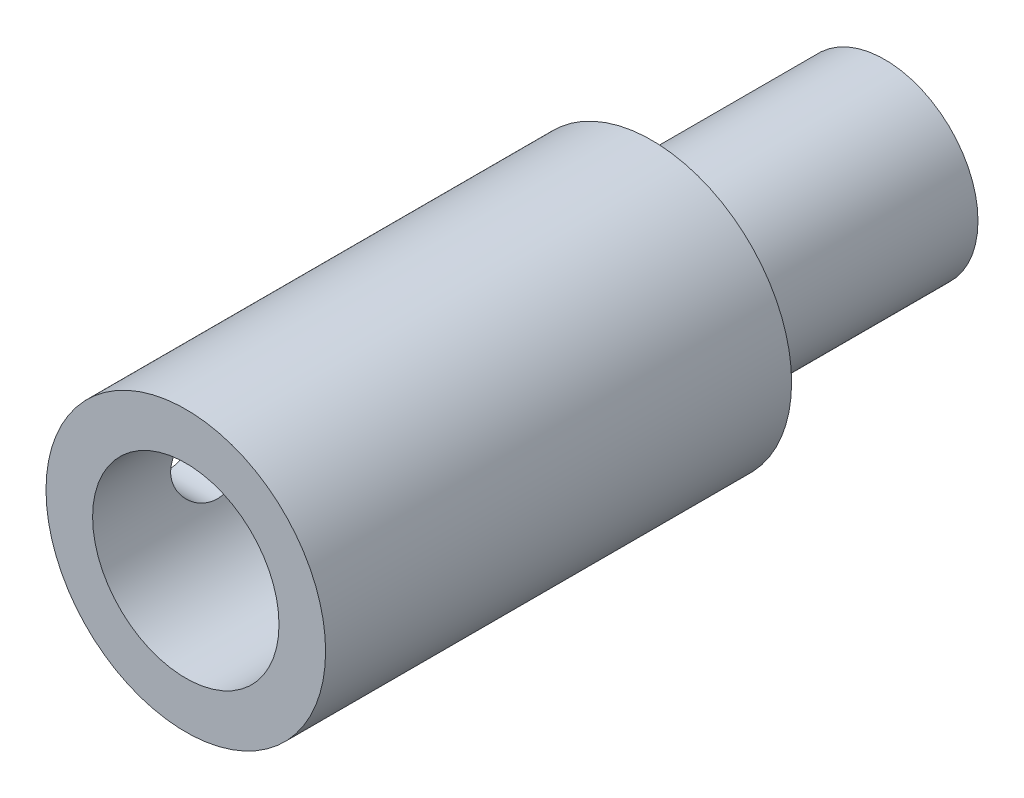
ISO-10303-21;
HEADER;
FILE_DESCRIPTION(('STEP AP214'),'2;1');
FILE_NAME('part.step','',(''),(''),'','','');
FILE_SCHEMA(('AUTOMOTIVE_DESIGN { 1 0 10303 214 1 1 1 1 }'));
ENDSEC;
DATA;
#1=APPLICATION_CONTEXT('core data for automotive mechanical design processes');
#2=APPLICATION_PROTOCOL_DEFINITION('international standard','automotive_design',2000,#1);
#3=PRODUCT_CONTEXT('',#1,'mechanical');
#4=PRODUCT('Part','Part','',(#3));
#5=PRODUCT_RELATED_PRODUCT_CATEGORY('part','',(#4));
#6=PRODUCT_DEFINITION_FORMATION('','',#4);
#7=PRODUCT_DEFINITION_CONTEXT('part definition',#1,'design');
#8=PRODUCT_DEFINITION('design','',#6,#7);
#9=PRODUCT_DEFINITION_SHAPE('','',#8);
#10=(LENGTH_UNIT() NAMED_UNIT(*) SI_UNIT(.MILLI.,.METRE.));
#11=(NAMED_UNIT(*) PLANE_ANGLE_UNIT() SI_UNIT($,.RADIAN.));
#12=(NAMED_UNIT(*) SI_UNIT($,.STERADIAN.) SOLID_ANGLE_UNIT());
#13=UNCERTAINTY_MEASURE_WITH_UNIT(LENGTH_MEASURE(1.E-05),#10,'distance_accuracy_value','');
#14=(GEOMETRIC_REPRESENTATION_CONTEXT(3) GLOBAL_UNCERTAINTY_ASSIGNED_CONTEXT((#13)) GLOBAL_UNIT_ASSIGNED_CONTEXT((#10,
#11,#12)) REPRESENTATION_CONTEXT('',''));
#15=CARTESIAN_POINT('',(0.,0.,0.));
#16=DIRECTION('',(0.,0.,1.));
#17=DIRECTION('',(1.,0.,0.));
#18=AXIS2_PLACEMENT_3D('',#15,#16,#17);
#19=CARTESIAN_POINT('',(0.,0.,6.35));
#20=DIRECTION('',(0.,0.,1.));
#21=DIRECTION('',(1.,0.,0.));
#22=AXIS2_PLACEMENT_3D('',#19,#20,#21);
#23=CYLINDRICAL_SURFACE('',#22,7.62);
#24=CARTESIAN_POINT('',(0.,0.,31.75));
#25=DIRECTION('',(0.,0.,1.));
#26=DIRECTION('',(1.,0.,0.));
#27=AXIS2_PLACEMENT_3D('',#24,#25,#26);
#28=CIRCLE('',#27,7.62000000000001);
#29=CARTESIAN_POINT('',(7.62000000000001,0.,31.75));
#30=VERTEX_POINT('',#29);
#31=EDGE_CURVE('E129',#30,#30,#28,.T.);
#32=ORIENTED_EDGE('',*,*,#31,.F.);
#33=EDGE_LOOP('',(#32));
#34=FACE_BOUND('',#33,.T.);
#35=CARTESIAN_POINT('',(0.,0.,6.35));
#36=DIRECTION('',(0.,0.,1.));
#37=DIRECTION('',(1.,0.,0.));
#38=AXIS2_PLACEMENT_3D('',#35,#36,#37);
#39=CIRCLE('',#38,7.62);
#40=CARTESIAN_POINT('',(7.62,0.,6.35));
#41=VERTEX_POINT('',#40);
#42=EDGE_CURVE('E132',#41,#41,#39,.T.);
#43=ORIENTED_EDGE('',*,*,#42,.T.);
#44=EDGE_LOOP('',(#43));
#45=FACE_BOUND('',#44,.T.);
#46=CARTESIAN_POINT('',(-7.62,0.,27.4955));
#47=CARTESIAN_POINT('',(-7.61999840371489,-0.115384234976174,27.4954975501655));
#48=CARTESIAN_POINT('',(-7.61735360943888,-0.230794221640972,27.4859380418919));
#49=CARTESIAN_POINT('',(-7.60706019382521,-0.45828078594663,27.4480257512945));
#50=CARTESIAN_POINT('',(-7.59940938644239,-0.570355884931931,27.4196647585943));
#51=CARTESIAN_POINT('',(-7.57994693502978,-0.787856787885331,27.3451478921896));
#52=CARTESIAN_POINT('',(-7.56814084640772,-0.893291249259123,27.2990157698717));
#53=CARTESIAN_POINT('',(-7.54161053278903,-1.09492736598934,27.1903564990847));
#54=CARTESIAN_POINT('',(-7.52688606490945,-1.1911282518891,27.1278279858812));
#55=CARTESIAN_POINT('',(-7.49570033202648,-1.37392583711982,26.9865324123662));
#56=CARTESIAN_POINT('',(-7.47920791848632,-1.46026384796045,26.9074375543392));
#57=CARTESIAN_POINT('',(-7.44654159417388,-1.61863230020288,26.7359546995604));
#58=CARTESIAN_POINT('',(-7.43036772749747,-1.69066077312892,26.6435648769115));
#59=CARTESIAN_POINT('',(-7.39984861049688,-1.81965051725813,26.4460202635813));
#60=CARTESIAN_POINT('',(-7.38554252396256,-1.87630986319297,26.340661716977));
#61=CARTESIAN_POINT('',(-7.36083858150032,-1.9710066443174,26.1214564177818));
#62=CARTESIAN_POINT('',(-7.35043995388807,-2.00904775687247,26.0076113465229));
#63=CARTESIAN_POINT('',(-7.3350506199154,-2.06452152504901,25.7775396770255));
#64=CARTESIAN_POINT('',(-7.32993656098249,-2.08242515806428,25.6614350953237));
#65=CARTESIAN_POINT('',(-7.32532721925929,-2.09858471146559,25.4277663451311));
#66=CARTESIAN_POINT('',(-7.32583081395801,-2.09684455704245,25.3102024729229));
#67=CARTESIAN_POINT('',(-7.33228973233598,-2.07413887766274,25.0806642801276));
#68=CARTESIAN_POINT('',(-7.33808211300826,-2.05374793491759,24.9686278011883));
#69=CARTESIAN_POINT('',(-7.35420439929986,-1.99524170042682,24.7496310405715));
#70=CARTESIAN_POINT('',(-7.36453468802629,-1.95712491218334,24.6426711883267));
#71=CARTESIAN_POINT('',(-7.38870887873646,-1.86379176902582,24.4353884589452));
#72=CARTESIAN_POINT('',(-7.40259306636977,-1.80837764151854,24.335159530076));
#73=CARTESIAN_POINT('',(-7.43228955730835,-1.68216064655033,24.145223376119));
#74=CARTESIAN_POINT('',(-7.44810226142561,-1.61135457771446,24.0555183458855));
#75=CARTESIAN_POINT('',(-7.48054820457899,-1.45344588486796,23.8858990302434));
#76=CARTESIAN_POINT('',(-7.49719085262834,-1.36586206100863,23.8064338575883));
#77=CARTESIAN_POINT('',(-7.52892964567979,-1.17840655115251,23.6632240835254));
#78=CARTESIAN_POINT('',(-7.54402572180985,-1.07853431836314,23.5994801820404));
#79=CARTESIAN_POINT('',(-7.57107330235333,-0.868612724826572,23.4893071213017));
#80=CARTESIAN_POINT('',(-7.58300916852022,-0.758516264795932,23.4429636122041));
#81=CARTESIAN_POINT('',(-7.60227864162203,-0.531690747695507,23.3695751818942));
#82=CARTESIAN_POINT('',(-7.60961332023581,-0.414963241998523,23.3425257666249));
#83=CARTESIAN_POINT('',(-7.61869013050499,-0.182018312961807,23.3092086628038));
#84=CARTESIAN_POINT('',(-7.62059639819917,-0.0658944150712358,23.3023308573568));
#85=CARTESIAN_POINT('',(-7.61907581124079,0.165849153438838,23.3078612650739));
#86=CARTESIAN_POINT('',(-7.61564954562294,0.281468878334933,23.3202673481283));
#87=CARTESIAN_POINT('',(-7.60395527620031,0.506714468164155,23.3635144380827));
#88=CARTESIAN_POINT('',(-7.59577772783283,0.616411548326361,23.3940112532671));
#89=CARTESIAN_POINT('',(-7.57551230343744,0.829119077867139,23.4721709815494));
#90=CARTESIAN_POINT('',(-7.56342399059726,0.932128778755964,23.5198358122937));
#91=CARTESIAN_POINT('',(-7.53629808095106,1.13087822581542,23.6320840751448));
#92=CARTESIAN_POINT('',(-7.52120510853578,1.22642566962745,23.6969942793889));
#93=CARTESIAN_POINT('',(-7.48981241656285,1.40548482823327,23.8414833562086));
#94=CARTESIAN_POINT('',(-7.4735124434597,1.48899400332079,23.9210653160289));
#95=CARTESIAN_POINT('',(-7.44093242879684,1.64420569965634,24.0954921346777));
#96=CARTESIAN_POINT('',(-7.42466778499404,1.71547667826613,24.1907246170135));
#97=CARTESIAN_POINT('',(-7.39453548040582,1.84104052022396,24.3921451619428));
#98=CARTESIAN_POINT('',(-7.38066772553304,1.89533405007168,24.4983327942419));
#99=CARTESIAN_POINT('',(-7.35706061775569,1.98499624349164,24.7181526593198));
#100=CARTESIAN_POINT('',(-7.34729812464098,2.02047128629566,24.8317388794484));
#101=CARTESIAN_POINT('',(-7.33301400477897,2.07172076384143,25.0635814925067));
#102=CARTESIAN_POINT('',(-7.32849093376875,2.08750062771314,25.1818365891474));
#103=CARTESIAN_POINT('',(-7.32532377345423,2.09858523323327,25.4152271511863));
#104=CARTESIAN_POINT('',(-7.32647988879781,2.09458578249237,25.5303273375897));
#105=CARTESIAN_POINT('',(-7.33407002021409,2.06785057400683,25.7581443383173));
#106=CARTESIAN_POINT('',(-7.34050388371675,2.04511535787875,25.8708612214418));
#107=CARTESIAN_POINT('',(-7.35780187070286,1.98196897937796,26.0897738012332));
#108=CARTESIAN_POINT('',(-7.36862677198719,1.94171408228171,26.1960178931749));
#109=CARTESIAN_POINT('',(-7.39348594773959,1.8447919665062,26.4003264346846));
#110=CARTESIAN_POINT('',(-7.40752075414075,1.78812202717414,26.4983895248485));
#111=CARTESIAN_POINT('',(-7.43776423913225,1.65790712195975,26.6868518497795));
#112=CARTESIAN_POINT('',(-7.45402700580892,1.5838915871721,26.7769173058881));
#113=CARTESIAN_POINT('',(-7.48660205438694,1.42196989994529,26.9435754131267));
#114=CARTESIAN_POINT('',(-7.50291434751125,1.33406032609079,27.0201647359077));
#115=CARTESIAN_POINT('',(-7.53420314037258,1.14438715781658,27.1594485925759));
#116=CARTESIAN_POINT('',(-7.54913989631905,1.04234959058651,27.2217797652592));
#117=CARTESIAN_POINT('',(-7.57555080491476,0.828834858251016,27.3283068707254));
#118=CARTESIAN_POINT('',(-7.58702703847247,0.717363417854805,27.3725137079514));
#119=CARTESIAN_POINT('',(-7.60385318783869,0.505357966603613,27.436195613294));
#120=CARTESIAN_POINT('',(-7.60986274630991,0.405682344017092,27.4583811358983));
#121=CARTESIAN_POINT('',(-7.61793663535998,0.204011015488787,27.4880335814159));
#122=CARTESIAN_POINT('',(-7.62000141133613,0.102015572789178,27.4955021659915));
#123=CARTESIAN_POINT('',(-7.62,0.,27.4955));
#124=B_SPLINE_CURVE_WITH_KNOTS('',3,(#46,#47,#48,#49,#50,#51,#52,#53,#54,#55,#56,#57,#58,#59,
#60,#61,#62,#63,#64,#65,#66,#67,#68,#69,#70,#71,#72,#73,#74,#75,#76,#77,#78,#79,#80,#81,#82,#83,
#84,#85,#86,#87,#88,#89,#90,#91,#92,#93,#94,#95,#96,#97,#98,#99,#100,#101,#102,#103,#104,#105,
#106,#107,#108,#109,#110,#111,#112,#113,#114,#115,#116,#117,#118,#119,#120,#121,#122,#123),
.UNSPECIFIED.,.T.,.F.,(4,2,2,2,2,2,2,2,2,2,2,2,2,2,2,2,2,2,2,2,2,2,2,2,2,2,2,2,2,2,2,2,2,2,2,2,
2,2,4),(0.,0.345778443868529,0.691707984468238,1.0371767800893,1.38267433952983,
1.73579368962354,2.08896158260496,2.4486338000132,2.8082349483526,3.15923847648558,
3.51017186888514,3.85064525220499,4.19114738508265,4.5356948795031,4.88031410515401,
5.23692088792707,5.59354354423661,5.9518992853123,6.31017152946467,6.6574895581222,
7.00476922455282,7.34564444301324,7.68655774863391,8.0344591380968,8.38243381702603,
8.74089291346692,9.09933793577449,9.45573450520718,9.81203280942728,10.1558881026244,
10.4997334559456,10.8405728243249,11.1814687162689,11.5329809593533,11.8845798977901,
12.244331471297,12.6038662827724,12.909616626445,13.2153324464328),.UNSPECIFIED.);
#125=CARTESIAN_POINT('',(-7.62,0.,27.4955));
#126=VERTEX_POINT('',#125);
#127=EDGE_CURVE('E84',#126,#126,#124,.T.);
#128=ORIENTED_EDGE('',*,*,#127,.T.);
#129=EDGE_LOOP('',(#128));
#130=FACE_BOUND('',#129,.T.);
#131=ADVANCED_FACE('F33',(#34,#45,#130),#23,.T.);
#132=CARTESIAN_POINT('',(0.,0.,6.35));
#133=DIRECTION('',(0.,0.,1.));
#134=DIRECTION('',(1.,0.,0.));
#135=AXIS2_PLACEMENT_3D('',#132,#133,#134);
#136=CYLINDRICAL_SURFACE('',#135,5.08);
#137=CARTESIAN_POINT('',(-5.08,0.,27.4955));
#138=CARTESIAN_POINT('',(-5.07999123467684,0.112343791521364,27.4954882941476));
#139=CARTESIAN_POINT('',(-5.07622995156059,0.22486906011313,27.486411861784));
#140=CARTESIAN_POINT('',(-5.06154833767239,0.44673478069224,27.4504262497401));
#141=CARTESIAN_POINT('',(-5.0506091236486,0.556066035436141,27.4234700309991));
#142=CARTESIAN_POINT('',(-5.02274796223018,0.767972171066482,27.3528855885036));
#143=CARTESIAN_POINT('',(-5.00584612745728,0.870568406803819,27.3093133729411));
#144=CARTESIAN_POINT('',(-4.96771023583895,1.06689732419383,27.2069626575312));
#145=CARTESIAN_POINT('',(-4.9464775398832,1.16063277666931,27.1481889329139));
#146=CARTESIAN_POINT('',(-4.90063663015429,1.34135837390127,27.0140344216021));
#147=CARTESIAN_POINT('',(-4.87591931071818,1.42785304925995,26.9380237587838));
#148=CARTESIAN_POINT('',(-4.82637443850815,1.58729139468641,26.7728841736331));
#149=CARTESIAN_POINT('',(-4.8015468355031,1.66022806037236,26.683748513001));
#150=CARTESIAN_POINT('',(-4.75326140641305,1.79393630047493,26.4897003239329));
#151=CARTESIAN_POINT('',(-4.72992652765778,1.85395592874013,26.3842358835607));
#152=CARTESIAN_POINT('',(-4.68899412834791,1.95518224913247,26.1636048872015));
#153=CARTESIAN_POINT('',(-4.67139371166576,1.99639844195244,26.048443265769));
#154=CARTESIAN_POINT('',(-4.64510147776961,2.05681247542565,25.8173880438077));
#155=CARTESIAN_POINT('',(-4.6360264036111,2.07696271699785,25.7017887383783));
#156=CARTESIAN_POINT('',(-4.62670797790542,2.0976452601342,25.4685209356461));
#157=CARTESIAN_POINT('',(-4.62645989327377,2.09818807531981,25.3508535811108));
#158=CARTESIAN_POINT('',(-4.63449845996098,2.08035881590385,25.1261894139942));
#159=CARTESIAN_POINT('',(-4.64214768471121,2.06339946079073,25.0190531383886));
#160=CARTESIAN_POINT('',(-4.66404365959833,2.01341334973622,24.8093099388359));
#161=CARTESIAN_POINT('',(-4.67829164395501,1.98038358795725,24.7067038661438));
#162=CARTESIAN_POINT('',(-4.71209952271417,1.89855364436961,24.5063707118765));
#163=CARTESIAN_POINT('',(-4.73176502443923,1.84943581055732,24.4087920029834));
#164=CARTESIAN_POINT('',(-4.77416642620872,1.73704815713403,24.2228875047758));
#165=CARTESIAN_POINT('',(-4.79690352183144,1.67377282057262,24.1345653423436));
#166=CARTESIAN_POINT('',(-4.8451737284304,1.52872328144584,23.9619962621095));
#167=CARTESIAN_POINT('',(-4.87078259082186,1.44585220219874,23.8786899137169));
#168=CARTESIAN_POINT('',(-4.92032176471338,1.26705684468009,23.7268452634594));
#169=CARTESIAN_POINT('',(-4.94425169757703,1.17112963620624,23.6583102856967));
#170=CARTESIAN_POINT('',(-4.98840673985106,0.966135189566403,23.536611837547));
#171=CARTESIAN_POINT('',(-5.00853774410325,0.856823399471742,23.4838236403434));
#172=CARTESIAN_POINT('',(-5.04210726167089,0.629828882012283,23.3977141593817));
#173=CARTESIAN_POINT('',(-5.05554939731068,0.512150724962932,23.3643823374218));
#174=CARTESIAN_POINT('',(-5.07355412310177,0.279630256483448,23.3200835303287));
#175=CARTESIAN_POINT('',(-5.0786172385582,0.165067198831444,23.3078538440214));
#176=CARTESIAN_POINT('',(-5.08088577962017,-0.06457624899332,23.3023511044206));
#177=CARTESIAN_POINT('',(-5.07809340451606,-0.179656485365717,23.3090727453526));
#178=CARTESIAN_POINT('',(-5.06529018796485,-0.401202849469185,23.3403714906685));
#179=CARTESIAN_POINT('',(-5.05563545244789,-0.507816253258888,23.3640681731419));
#180=CARTESIAN_POINT('',(-5.03045587509926,-0.715442401128559,23.4274259623481));
#181=CARTESIAN_POINT('',(-5.01493028818302,-0.816454432457625,23.4670890954648));
#182=CARTESIAN_POINT('',(-4.97890455681999,-1.01353870947488,23.5625505125757));
#183=CARTESIAN_POINT('',(-4.95826523751187,-1.10936107395884,23.6188104734304));
#184=CARTESIAN_POINT('',(-4.91422395598186,-1.29054666097552,23.7453600965075));
#185=CARTESIAN_POINT('',(-4.89082085250686,-1.3759055329448,23.8156555627641));
#186=CARTESIAN_POINT('',(-4.84175175722566,-1.54002732751781,23.9740494671112));
#187=CARTESIAN_POINT('',(-4.81604213947167,-1.61790842993514,24.0630504565299));
#188=CARTESIAN_POINT('',(-4.76674089754855,-1.75786841062782,24.2532805390728));
#189=CARTESIAN_POINT('',(-4.74314971998218,-1.81994396186663,24.354512200127));
#190=CARTESIAN_POINT('',(-4.700634494316,-1.92712698510062,24.5682711205773));
#191=CARTESIAN_POINT('',(-4.6817753001911,-1.97200269729399,24.6809284333302));
#192=CARTESIAN_POINT('',(-4.6517768301359,-2.0417741507005,24.9132206407924));
#193=CARTESIAN_POINT('',(-4.64063136038668,-2.06668592471936,25.0328498534511));
#194=CARTESIAN_POINT('',(-4.62825540393854,-2.09424427404141,25.2659264469107));
#195=CARTESIAN_POINT('',(-4.62633788448535,-2.09843432692439,25.3791557687116));
#196=CARTESIAN_POINT('',(-4.63081596363407,-2.08853386402841,25.6046331578642));
#197=CARTESIAN_POINT('',(-4.63721034573725,-2.07444602333397,25.7168813663876));
#198=CARTESIAN_POINT('',(-4.65696922831749,-2.02967739868347,25.9320450004973));
#199=CARTESIAN_POINT('',(-4.67000921724318,-1.99976687215567,26.0351533035061));
#200=CARTESIAN_POINT('',(-4.70134202232362,-1.92494661330618,26.2349164435421));
#201=CARTESIAN_POINT('',(-4.71963630813257,-1.88003268388054,26.331569465658));
#202=CARTESIAN_POINT('',(-4.76076529296853,-1.77340339062314,26.5219459885666));
#203=CARTESIAN_POINT('',(-4.78380523874584,-1.71084803371074,26.6151538701972));
#204=CARTESIAN_POINT('',(-4.83124338088621,-1.57190082035035,26.7902330428256));
#205=CARTESIAN_POINT('',(-4.85564203107722,-1.49550432131662,26.8721005137235));
#206=CARTESIAN_POINT('',(-4.90512318456749,-1.32461938219795,27.0281325561537));
#207=CARTESIAN_POINT('',(-4.93013186386217,-1.22923314062733,27.101341813979));
#208=CARTESIAN_POINT('',(-4.97627182170086,-1.02659619824119,27.2307560026142));
#209=CARTESIAN_POINT('',(-4.99740132499803,-0.919340101172426,27.2869531556847));
#210=CARTESIAN_POINT('',(-5.0330822807054,-0.697756745339234,27.3795029495901));
#211=CARTESIAN_POINT('',(-5.04774016385701,-0.583581994694776,27.4161788802054));
#212=CARTESIAN_POINT('',(-5.06926137244854,-0.350163421100822,27.4694790776771));
#213=CARTESIAN_POINT('',(-5.07614918409962,-0.230936757858902,27.4861663461317));
#214=CARTESIAN_POINT('',(-5.07959607176085,-0.0742242549385417,27.4945179983192));
#215=CARTESIAN_POINT('',(-5.08000289634725,-0.0371220348113304,27.4955038679935));
#216=CARTESIAN_POINT('',(-5.08,0.,27.4955));
#217=B_SPLINE_CURVE_WITH_KNOTS('',3,(#137,#138,#139,#140,#141,#142,#143,#144,#145,#146,#147,
#148,#149,#150,#151,#152,#153,#154,#155,#156,#157,#158,#159,#160,#161,#162,#163,#164,#165,#166,
#167,#168,#169,#170,#171,#172,#173,#174,#175,#176,#177,#178,#179,#180,#181,#182,#183,#184,#185,
#186,#187,#188,#189,#190,#191,#192,#193,#194,#195,#196,#197,#198,#199,#200,#201,#202,#203,#204,
#205,#206,#207,#208,#209,#210,#211,#212,#213,#214,#215,#216),.UNSPECIFIED.,.T.,.F.,(4,2,2,2,2,2,
2,2,2,2,2,2,2,2,2,2,2,2,2,2,2,2,2,2,2,2,2,2,2,2,2,2,2,2,2,2,2,2,2,4),(0.,0.336927315438687,
0.674744571141459,1.01143305650358,1.34801590653484,1.6997918632296,2.05174905349304,
2.42059974254163,2.78926385776955,3.14042613645065,3.4914001169821,3.81610404686838,
4.14086873331914,4.47247694912704,4.8042146130656,5.1633778507123,5.52262182911208,
5.88984588013198,6.25687084572996,6.60105549938262,6.94514380174463,7.27256946118905,
7.60003668900449,7.93764590654724,8.2753950242141,8.63682016918012,8.99832133062843,
9.36453531236744,9.7304548963751,10.0686593549794,10.4068143208203,10.7298461056517,
11.0529683322963,11.3952969958058,11.7377406962422,12.1044218898701,12.4712704736294,
12.8318381428572,13.1912663350801,13.3025980550019),.UNSPECIFIED.);
#218=CARTESIAN_POINT('',(-5.08,0.,27.4955));
#219=VERTEX_POINT('',#218);
#220=EDGE_CURVE('E136',#219,#219,#217,.T.);
#221=ORIENTED_EDGE('',*,*,#220,.T.);
#222=EDGE_LOOP('',(#221));
#223=FACE_BOUND('',#222,.T.);
#224=CARTESIAN_POINT('',(0.,0.,31.75));
#225=DIRECTION('',(0.,0.,1.));
#226=DIRECTION('',(1.,0.,0.));
#227=AXIS2_PLACEMENT_3D('',#224,#225,#226);
#228=CIRCLE('',#227,5.08);
#229=CARTESIAN_POINT('',(5.08,0.,31.75));
#230=VERTEX_POINT('',#229);
#231=EDGE_CURVE('E126',#230,#230,#228,.T.);
#232=ORIENTED_EDGE('',*,*,#231,.T.);
#233=EDGE_LOOP('',(#232));
#234=FACE_BOUND('',#233,.T.);
#235=CARTESIAN_POINT('',(0.,0.,8.89));
#236=DIRECTION('',(0.,0.,1.));
#237=DIRECTION('',(1.,0.,0.));
#238=AXIS2_PLACEMENT_3D('',#235,#236,#237);
#239=CIRCLE('',#238,5.08);
#240=CARTESIAN_POINT('',(5.08,0.,8.89));
#241=VERTEX_POINT('',#240);
#242=EDGE_CURVE('E123',#241,#241,#239,.T.);
#243=ORIENTED_EDGE('',*,*,#242,.F.);
#244=EDGE_LOOP('',(#243));
#245=FACE_BOUND('',#244,.T.);
#246=CARTESIAN_POINT('',(5.08,0.,23.3045));
#247=CARTESIAN_POINT('',(5.07999123467684,0.112343791521364,23.3045117058524));
#248=CARTESIAN_POINT('',(5.07622995156059,0.22486906011313,23.313588138216));
#249=CARTESIAN_POINT('',(5.06154833767239,0.44673478069224,23.3495737502599));
#250=CARTESIAN_POINT('',(5.0506091236486,0.556066035436141,23.3765299690009));
#251=CARTESIAN_POINT('',(5.02274796223018,0.767972171066482,23.4471144114964));
#252=CARTESIAN_POINT('',(5.00584612745728,0.870568406803819,23.4906866270589));
#253=CARTESIAN_POINT('',(4.96771023583895,1.06689732419383,23.5930373424688));
#254=CARTESIAN_POINT('',(4.9464775398832,1.16063277666931,23.6518110670861));
#255=CARTESIAN_POINT('',(4.90063663015429,1.34135837390127,23.7859655783979));
#256=CARTESIAN_POINT('',(4.87591931071818,1.42785304925995,23.8619762412162));
#257=CARTESIAN_POINT('',(4.82637443850815,1.58729139468641,24.0271158263669));
#258=CARTESIAN_POINT('',(4.8015468355031,1.66022806037236,24.116251486999));
#259=CARTESIAN_POINT('',(4.75326140641305,1.79393630047493,24.3102996760671));
#260=CARTESIAN_POINT('',(4.72992652765778,1.85395592874013,24.4157641164393));
#261=CARTESIAN_POINT('',(4.68899412834791,1.95518224913247,24.6363951127985));
#262=CARTESIAN_POINT('',(4.67139371166576,1.99639844195244,24.751556734231));
#263=CARTESIAN_POINT('',(4.64510147776961,2.05681247542565,24.9826119561923));
#264=CARTESIAN_POINT('',(4.6360264036111,2.07696271699785,25.0982112616217));
#265=CARTESIAN_POINT('',(4.62670797790542,2.0976452601342,25.3314790643539));
#266=CARTESIAN_POINT('',(4.62645989327377,2.09818807531981,25.4491464188892));
#267=CARTESIAN_POINT('',(4.63449845996098,2.08035881590385,25.6738105860058));
#268=CARTESIAN_POINT('',(4.64214768471121,2.06339946079073,25.7809468616114));
#269=CARTESIAN_POINT('',(4.66404365959833,2.01341334973622,25.9906900611641));
#270=CARTESIAN_POINT('',(4.67829164395501,1.98038358795725,26.0932961338562));
#271=CARTESIAN_POINT('',(4.71209952271417,1.89855364436961,26.2936292881234));
#272=CARTESIAN_POINT('',(4.73176502443923,1.84943581055732,26.3912079970166));
#273=CARTESIAN_POINT('',(4.77416642620872,1.73704815713403,26.5771124952242));
#274=CARTESIAN_POINT('',(4.79690352183144,1.67377282057262,26.6654346576564));
#275=CARTESIAN_POINT('',(4.8451737284304,1.52872328144584,26.8380037378905));
#276=CARTESIAN_POINT('',(4.87078259082186,1.44585220219874,26.9213100862831));
#277=CARTESIAN_POINT('',(4.92032176471338,1.26705684468009,27.0731547365406));
#278=CARTESIAN_POINT('',(4.94425169757703,1.17112963620624,27.1416897143033));
#279=CARTESIAN_POINT('',(4.98840673985106,0.966135189566402,27.263388162453));
#280=CARTESIAN_POINT('',(5.00853774410325,0.856823399471741,27.3161763596566));
#281=CARTESIAN_POINT('',(5.04210726167089,0.629828882012282,27.4022858406183));
#282=CARTESIAN_POINT('',(5.05554939731068,0.512150724962931,27.4356176625782));
#283=CARTESIAN_POINT('',(5.07355412310177,0.279630256483447,27.4799164696713));
#284=CARTESIAN_POINT('',(5.0786172385582,0.165067198831444,27.4921461559786));
#285=CARTESIAN_POINT('',(5.08088577962017,-0.0645762489933199,27.4976488955794));
#286=CARTESIAN_POINT('',(5.07809340451606,-0.179656485365717,27.4909272546474));
#287=CARTESIAN_POINT('',(5.06529018796485,-0.401202849469185,27.4596285093314));
#288=CARTESIAN_POINT('',(5.05563545244789,-0.507816253258888,27.4359318268581));
#289=CARTESIAN_POINT('',(5.03045587509926,-0.715442401128559,27.3725740376519));
#290=CARTESIAN_POINT('',(5.01493028818302,-0.816454432457625,27.3329109045352));
#291=CARTESIAN_POINT('',(4.97890455682,-1.01353870947488,27.2374494874243));
#292=CARTESIAN_POINT('',(4.95826523751187,-1.10936107395884,27.1811895265696));
#293=CARTESIAN_POINT('',(4.91422395598186,-1.29054666097552,27.0546399034925));
#294=CARTESIAN_POINT('',(4.89082085250686,-1.3759055329448,26.9843444372359));
#295=CARTESIAN_POINT('',(4.84175175722566,-1.54002732751781,26.8259505328888));
#296=CARTESIAN_POINT('',(4.81604213947167,-1.61790842993514,26.7369495434701));
#297=CARTESIAN_POINT('',(4.76674089754855,-1.75786841062782,26.5467194609272));
#298=CARTESIAN_POINT('',(4.74314971998218,-1.81994396186663,26.445487799873));
#299=CARTESIAN_POINT('',(4.700634494316,-1.92712698510062,26.2317288794227));
#300=CARTESIAN_POINT('',(4.6817753001911,-1.97200269729399,26.1190715666698));
#301=CARTESIAN_POINT('',(4.6517768301359,-2.0417741507005,25.8867793592076));
#302=CARTESIAN_POINT('',(4.64063136038668,-2.06668592471936,25.7671501465489));
#303=CARTESIAN_POINT('',(4.62825540393854,-2.09424427404141,25.5340735530893));
#304=CARTESIAN_POINT('',(4.62633788448535,-2.09843432692439,25.4208442312884));
#305=CARTESIAN_POINT('',(4.63081596363407,-2.08853386402841,25.1953668421358));
#306=CARTESIAN_POINT('',(4.63721034573725,-2.07444602333397,25.0831186336124));
#307=CARTESIAN_POINT('',(4.65696922831749,-2.02967739868347,24.8679549995027));
#308=CARTESIAN_POINT('',(4.67000921724318,-1.99976687215567,24.7648466964939));
#309=CARTESIAN_POINT('',(4.70134202232362,-1.92494661330618,24.5650835564579));
#310=CARTESIAN_POINT('',(4.71963630813257,-1.88003268388054,24.468430534342));
#311=CARTESIAN_POINT('',(4.76076529296853,-1.77340339062314,24.2780540114334));
#312=CARTESIAN_POINT('',(4.78380523874583,-1.71084803371075,24.1848461298028));
#313=CARTESIAN_POINT('',(4.83124338088621,-1.57190082035035,24.0097669571744));
#314=CARTESIAN_POINT('',(4.85564203107722,-1.49550432131662,23.9278994862765));
#315=CARTESIAN_POINT('',(4.90512318456749,-1.32461938219795,23.7718674438463));
#316=CARTESIAN_POINT('',(4.93013186386217,-1.22923314062733,23.698658186021));
#317=CARTESIAN_POINT('',(4.97627182170086,-1.02659619824119,23.5692439973858));
#318=CARTESIAN_POINT('',(4.99740132499803,-0.919340101172426,23.5130468443153));
#319=CARTESIAN_POINT('',(5.0330822807054,-0.697756745339234,23.4204970504099));
#320=CARTESIAN_POINT('',(5.04774016385701,-0.583581994694776,23.3838211197946));
#321=CARTESIAN_POINT('',(5.06926137244854,-0.350163421100822,23.3305209223229));
#322=CARTESIAN_POINT('',(5.07614918409962,-0.230936757858902,23.3138336538683));
#323=CARTESIAN_POINT('',(5.07959607176085,-0.0742242549385417,23.3054820016808));
#324=CARTESIAN_POINT('',(5.08000289634725,-0.0371220348113304,23.3044961320064));
#325=CARTESIAN_POINT('',(5.08,0.,23.3045));
#326=B_SPLINE_CURVE_WITH_KNOTS('',3,(#246,#247,#248,#249,#250,#251,#252,#253,#254,#255,#256,
#257,#258,#259,#260,#261,#262,#263,#264,#265,#266,#267,#268,#269,#270,#271,#272,#273,#274,#275,
#276,#277,#278,#279,#280,#281,#282,#283,#284,#285,#286,#287,#288,#289,#290,#291,#292,#293,#294,
#295,#296,#297,#298,#299,#300,#301,#302,#303,#304,#305,#306,#307,#308,#309,#310,#311,#312,#313,
#314,#315,#316,#317,#318,#319,#320,#321,#322,#323,#324,#325),.UNSPECIFIED.,.T.,.F.,(4,2,2,2,2,2,
2,2,2,2,2,2,2,2,2,2,2,2,2,2,2,2,2,2,2,2,2,2,2,2,2,2,2,2,2,2,2,2,2,4),(0.,0.336927315438687,
0.674744571141459,1.01143305650358,1.34801590653484,1.6997918632296,2.05174905349304,
2.42059974254163,2.78926385776955,3.14042613645065,3.4914001169821,3.81610404686838,
4.14086873331914,4.47247694912704,4.8042146130656,5.1633778507123,5.52262182911208,
5.88984588013198,6.25687084572996,6.60105549938262,6.94514380174464,7.27256946118905,
7.60003668900449,7.93764590654724,8.2753950242141,8.63682016918012,8.99832133062843,
9.36453531236744,9.7304548963751,10.0686593549794,10.4068143208203,10.7298461056517,
11.0529683322963,11.3952969958058,11.7377406962422,12.1044218898701,12.4712704736294,
12.8318381428572,13.1912663350801,13.3025980550019),.UNSPECIFIED.);
#327=CARTESIAN_POINT('',(5.08,0.,23.3045));
#328=VERTEX_POINT('',#327);
#329=EDGE_CURVE('E37',#328,#328,#326,.T.);
#330=ORIENTED_EDGE('',*,*,#329,.T.);
#331=EDGE_LOOP('',(#330));
#332=FACE_BOUND('',#331,.T.);
#333=ADVANCED_FACE('F142',(#223,#234,#245,#332),#136,.F.);
#334=CARTESIAN_POINT('',(2.54,0.,-6.35));
#335=DIRECTION('',(0.,0.,-1.));
#336=DIRECTION('',(-1.,0.,0.));
#337=AXIS2_PLACEMENT_3D('',#334,#335,#336);
#338=PLANE('',#337);
#339=CARTESIAN_POINT('',(0.,0.,-6.35));
#340=DIRECTION('',(0.,0.,1.));
#341=DIRECTION('',(1.,0.,0.));
#342=AXIS2_PLACEMENT_3D('',#339,#340,#341);
#343=CIRCLE('',#342,2.54);
#344=CARTESIAN_POINT('',(2.54,0.,-6.35));
#345=VERTEX_POINT('',#344);
#346=EDGE_CURVE('E117',#345,#345,#343,.T.);
#347=ORIENTED_EDGE('',*,*,#346,.T.);
#348=EDGE_LOOP('',(#347));
#349=FACE_BOUND('',#348,.T.);
#350=CARTESIAN_POINT('',(0.,0.,-6.35));
#351=DIRECTION('',(0.,0.,1.));
#352=DIRECTION('',(1.,0.,0.));
#353=AXIS2_PLACEMENT_3D('',#350,#351,#352);
#354=CIRCLE('',#353,5.08);
#355=CARTESIAN_POINT('',(5.08,0.,-6.35));
#356=VERTEX_POINT('',#355);
#357=EDGE_CURVE('E11',#356,#356,#354,.T.);
#358=ORIENTED_EDGE('',*,*,#357,.F.);
#359=EDGE_LOOP('',(#358));
#360=FACE_BOUND('',#359,.T.);
#361=ADVANCED_FACE('F35',(#349,#360),#338,.T.);
#362=CARTESIAN_POINT('',(0.,0.,6.35));
#363=DIRECTION('',(0.,0.,1.));
#364=DIRECTION('',(1.,0.,0.));
#365=AXIS2_PLACEMENT_3D('',#362,#363,#364);
#366=CYLINDRICAL_SURFACE('',#365,5.08);
#367=ORIENTED_EDGE('',*,*,#357,.T.);
#368=EDGE_LOOP('',(#367));
#369=FACE_BOUND('',#368,.T.);
#370=CARTESIAN_POINT('',(0.,0.,6.35));
#371=DIRECTION('',(0.,0.,1.));
#372=DIRECTION('',(1.,0.,0.));
#373=AXIS2_PLACEMENT_3D('',#370,#371,#372);
#374=CIRCLE('',#373,5.08);
#375=CARTESIAN_POINT('',(5.08,0.,6.35));
#376=VERTEX_POINT('',#375);
#377=EDGE_CURVE('E47',#376,#376,#374,.T.);
#378=ORIENTED_EDGE('',*,*,#377,.F.);
#379=EDGE_LOOP('',(#378));
#380=FACE_BOUND('',#379,.T.);
#381=ADVANCED_FACE('F190',(#369,#380),#366,.T.);
#382=CARTESIAN_POINT('',(5.08,0.,6.35));
#383=DIRECTION('',(0.,0.,-1.));
#384=DIRECTION('',(-1.,0.,0.));
#385=AXIS2_PLACEMENT_3D('',#382,#383,#384);
#386=PLANE('',#385);
#387=ORIENTED_EDGE('',*,*,#377,.T.);
#388=EDGE_LOOP('',(#387));
#389=FACE_BOUND('',#388,.T.);
#390=ORIENTED_EDGE('',*,*,#42,.F.);
#391=EDGE_LOOP('',(#390));
#392=FACE_BOUND('',#391,.T.);
#393=ADVANCED_FACE('F176',(#389,#392),#386,.T.);
#394=CARTESIAN_POINT('',(7.62000000000001,0.,31.75));
#395=DIRECTION('',(0.,0.,1.));
#396=DIRECTION('',(1.,0.,0.));
#397=AXIS2_PLACEMENT_3D('',#394,#395,#396);
#398=PLANE('',#397);
#399=ORIENTED_EDGE('',*,*,#31,.T.);
#400=EDGE_LOOP('',(#399));
#401=FACE_BOUND('',#400,.T.);
#402=ORIENTED_EDGE('',*,*,#231,.F.);
#403=EDGE_LOOP('',(#402));
#404=FACE_BOUND('',#403,.T.);
#405=ADVANCED_FACE('F171',(#401,#404),#398,.T.);
#406=CARTESIAN_POINT('',(5.08,0.,8.89));
#407=DIRECTION('',(0.,0.,1.));
#408=DIRECTION('',(1.,0.,0.));
#409=AXIS2_PLACEMENT_3D('',#406,#407,#408);
#410=PLANE('',#409);
#411=ORIENTED_EDGE('',*,*,#242,.T.);
#412=EDGE_LOOP('',(#411));
#413=FACE_BOUND('',#412,.T.);
#414=CARTESIAN_POINT('',(0.,0.,8.89));
#415=DIRECTION('',(0.,0.,1.));
#416=DIRECTION('',(1.,0.,0.));
#417=AXIS2_PLACEMENT_3D('',#414,#415,#416);
#418=CIRCLE('',#417,2.54);
#419=CARTESIAN_POINT('',(-1.651,-1.93023288750347,8.89));
#420=VERTEX_POINT('',#419);
#421=CARTESIAN_POINT('',(1.651,-1.93023288750347,8.89));
#422=VERTEX_POINT('',#421);
#423=EDGE_CURVE('E121',#420,#422,#418,.T.);
#424=ORIENTED_EDGE('',*,*,#423,.F.);
#425=DIRECTION('',(0.,-1.,0.));
#426=VECTOR('',#425,1.);
#427=CARTESIAN_POINT('',(-1.651,-1.93023288750347,8.89));
#428=LINE('',#427,#426);
#429=CARTESIAN_POINT('',(-1.651,1.93023288750347,8.89));
#430=VERTEX_POINT('',#429);
#431=EDGE_CURVE('E107',#430,#420,#428,.T.);
#432=ORIENTED_EDGE('',*,*,#431,.F.);
#433=CARTESIAN_POINT('',(1.651,1.93023288750347,8.89));
#434=VERTEX_POINT('',#433);
#435=EDGE_CURVE('E120',#434,#430,#418,.T.);
#436=ORIENTED_EDGE('',*,*,#435,.F.);
#437=DIRECTION('',(0.,1.,0.));
#438=VECTOR('',#437,1.);
#439=CARTESIAN_POINT('',(1.651,-1.93023288750347,8.89));
#440=LINE('',#439,#438);
#441=EDGE_CURVE('E90',#422,#434,#440,.T.);
#442=ORIENTED_EDGE('',*,*,#441,.F.);
#443=EDGE_LOOP('',(#424,#432,#436,#442));
#444=FACE_BOUND('',#443,.T.);
#445=ADVANCED_FACE('F169',(#413,#444),#410,.T.);
#446=CARTESIAN_POINT('',(0.,0.,6.35));
#447=DIRECTION('',(0.,0.,1.));
#448=DIRECTION('',(1.,0.,0.));
#449=AXIS2_PLACEMENT_3D('',#446,#447,#448);
#450=CYLINDRICAL_SURFACE('',#449,2.54);
#451=DIRECTION('',(0.,0.,-1.));
#452=VECTOR('',#451,1.);
#453=CARTESIAN_POINT('',(1.651,-1.93023288750347,12.8515043859625));
#454=LINE('',#453,#452);
#455=CARTESIAN_POINT('',(1.651,-1.93023288750347,-3.302));
#456=VERTEX_POINT('',#455);
#457=EDGE_CURVE('E55',#422,#456,#454,.T.);
#458=ORIENTED_EDGE('',*,*,#457,.T.);
#459=CARTESIAN_POINT('',(0.,0.,-3.302));
#460=DIRECTION('',(0.,0.,-1.));
#461=DIRECTION('',(-1.,0.,0.));
#462=AXIS2_PLACEMENT_3D('',#459,#460,#461);
#463=CIRCLE('',#462,2.54);
#464=CARTESIAN_POINT('',(1.651,1.93023288750347,-3.302));
#465=VERTEX_POINT('',#464);
#466=EDGE_CURVE('E77',#465,#456,#463,.T.);
#467=ORIENTED_EDGE('',*,*,#466,.F.);
#468=DIRECTION('',(0.,0.,-1.));
#469=VECTOR('',#468,1.);
#470=CARTESIAN_POINT('',(1.651,1.93023288750347,12.8515043859625));
#471=LINE('',#470,#469);
#472=EDGE_CURVE('E61',#434,#465,#471,.T.);
#473=ORIENTED_EDGE('',*,*,#472,.F.);
#474=ORIENTED_EDGE('',*,*,#435,.T.);
#475=DIRECTION('',(0.,0.,-1.));
#476=VECTOR('',#475,1.);
#477=CARTESIAN_POINT('',(-1.651,1.93023288750347,12.8515043859625));
#478=LINE('',#477,#476);
#479=CARTESIAN_POINT('',(-1.651,1.93023288750347,-3.302));
#480=VERTEX_POINT('',#479);
#481=EDGE_CURVE('E115',#430,#480,#478,.T.);
#482=ORIENTED_EDGE('',*,*,#481,.T.);
#483=CARTESIAN_POINT('',(0.,0.,-3.302));
#484=DIRECTION('',(0.,0.,-1.));
#485=DIRECTION('',(-1.,0.,0.));
#486=AXIS2_PLACEMENT_3D('',#483,#484,#485);
#487=CIRCLE('',#486,2.54);
#488=CARTESIAN_POINT('',(-1.651,-1.93023288750347,-3.302));
#489=VERTEX_POINT('',#488);
#490=EDGE_CURVE('E103',#489,#480,#487,.T.);
#491=ORIENTED_EDGE('',*,*,#490,.F.);
#492=DIRECTION('',(0.,0.,-1.));
#493=VECTOR('',#492,1.);
#494=CARTESIAN_POINT('',(-1.651,-1.93023288750347,12.8515043859625));
#495=LINE('',#494,#493);
#496=EDGE_CURVE('E112',#420,#489,#495,.T.);
#497=ORIENTED_EDGE('',*,*,#496,.F.);
#498=ORIENTED_EDGE('',*,*,#423,.T.);
#499=EDGE_LOOP('',(#458,#467,#473,#474,#482,#491,#497,#498));
#500=FACE_BOUND('',#499,.T.);
#501=ORIENTED_EDGE('',*,*,#346,.F.);
#502=EDGE_LOOP('',(#501));
#503=FACE_BOUND('',#502,.T.);
#504=ADVANCED_FACE('F78',(#500,#503),#450,.F.);
#505=CARTESIAN_POINT('',(0.,0.,-3.302));
#506=DIRECTION('',(0.,0.,-1.));
#507=DIRECTION('',(-1.,0.,0.));
#508=AXIS2_PLACEMENT_3D('',#505,#506,#507);
#509=PLANE('',#508);
#510=ORIENTED_EDGE('',*,*,#490,.T.);
#511=DIRECTION('',(0.,-1.,0.));
#512=VECTOR('',#511,1.);
#513=CARTESIAN_POINT('',(-1.651,-1.93023288750347,-3.302));
#514=LINE('',#513,#512);
#515=EDGE_CURVE('E104',#480,#489,#514,.T.);
#516=ORIENTED_EDGE('',*,*,#515,.T.);
#517=EDGE_LOOP('',(#510,#516));
#518=FACE_BOUND('',#517,.T.);
#519=ADVANCED_FACE('F161',(#518),#509,.T.);
#520=CARTESIAN_POINT('',(-1.651,-1.93023288750347,12.8515043859625));
#521=DIRECTION('',(1.,0.,0.));
#522=DIRECTION('',(0.,0.,-1.));
#523=AXIS2_PLACEMENT_3D('',#520,#521,#522);
#524=PLANE('',#523);
#525=ORIENTED_EDGE('',*,*,#481,.F.);
#526=ORIENTED_EDGE('',*,*,#431,.T.);
#527=ORIENTED_EDGE('',*,*,#496,.T.);
#528=ORIENTED_EDGE('',*,*,#515,.F.);
#529=EDGE_LOOP('',(#525,#526,#527,#528));
#530=FACE_BOUND('',#529,.T.);
#531=ADVANCED_FACE('F158',(#530),#524,.T.);
#532=CARTESIAN_POINT('',(0.,0.,-3.302));
#533=DIRECTION('',(0.,0.,-1.));
#534=DIRECTION('',(-1.,0.,0.));
#535=AXIS2_PLACEMENT_3D('',#532,#533,#534);
#536=PLANE('',#535);
#537=ORIENTED_EDGE('',*,*,#466,.T.);
#538=DIRECTION('',(0.,1.,0.));
#539=VECTOR('',#538,1.);
#540=CARTESIAN_POINT('',(1.651,-1.93023288750347,-3.302));
#541=LINE('',#540,#539);
#542=EDGE_CURVE('E83',#456,#465,#541,.T.);
#543=ORIENTED_EDGE('',*,*,#542,.T.);
#544=EDGE_LOOP('',(#537,#543));
#545=FACE_BOUND('',#544,.T.);
#546=ADVANCED_FACE('F92',(#545),#536,.T.);
#547=CARTESIAN_POINT('',(1.651,-1.93023288750347,12.8515043859625));
#548=DIRECTION('',(-1.,0.,0.));
#549=DIRECTION('',(0.,0.,1.));
#550=AXIS2_PLACEMENT_3D('',#547,#548,#549);
#551=PLANE('',#550);
#552=ORIENTED_EDGE('',*,*,#457,.F.);
#553=ORIENTED_EDGE('',*,*,#441,.T.);
#554=ORIENTED_EDGE('',*,*,#472,.T.);
#555=ORIENTED_EDGE('',*,*,#542,.F.);
#556=EDGE_LOOP('',(#552,#553,#554,#555));
#557=FACE_BOUND('',#556,.T.);
#558=ADVANCED_FACE('F88',(#557),#551,.T.);
#559=CARTESIAN_POINT('',(6.35,0.,25.4));
#560=DIRECTION('',(-1.,0.,0.));
#561=DIRECTION('',(0.,0.,1.));
#562=AXIS2_PLACEMENT_3D('',#559,#560,#561);
#563=CYLINDRICAL_SURFACE('',#562,2.0955);
#564=ORIENTED_EDGE('',*,*,#127,.F.);
#565=EDGE_LOOP('',(#564));
#566=FACE_BOUND('',#565,.T.);
#567=ORIENTED_EDGE('',*,*,#220,.F.);
#568=EDGE_LOOP('',(#567));
#569=FACE_BOUND('',#568,.T.);
#570=ADVANCED_FACE('F146',(#566,#569),#563,.F.);
#571=ORIENTED_EDGE('',*,*,#329,.F.);
#572=EDGE_LOOP('',(#571));
#573=FACE_BOUND('',#572,.T.);
#574=CARTESIAN_POINT('',(6.35,0.,25.4));
#575=DIRECTION('',(1.,0.,0.));
#576=DIRECTION('',(0.,0.,-1.));
#577=AXIS2_PLACEMENT_3D('',#574,#575,#576);
#578=CIRCLE('',#577,2.0955);
#579=CARTESIAN_POINT('',(6.35,0.,23.3045));
#580=VERTEX_POINT('',#579);
#581=EDGE_CURVE('E141',#580,#580,#578,.T.);
#582=ORIENTED_EDGE('',*,*,#581,.T.);
#583=EDGE_LOOP('',(#582));
#584=FACE_BOUND('',#583,.T.);
#585=ADVANCED_FACE('F151',(#573,#584),#563,.F.);
#586=CARTESIAN_POINT('',(6.35,0.,25.4));
#587=DIRECTION('',(1.,0.,0.));
#588=DIRECTION('',(0.,0.,-1.));
#589=AXIS2_PLACEMENT_3D('',#586,#587,#588);
#590=PLANE('',#589);
#591=ORIENTED_EDGE('',*,*,#581,.F.);
#592=EDGE_LOOP('',(#591));
#593=FACE_BOUND('',#592,.T.);
#594=ADVANCED_FACE('F153',(#593),#590,.F.);
#595=CLOSED_SHELL('',(#131,#333,#361,#381,#393,#405,#445,#504,#519,#531,#546,#558,#570,#585,#594));
#596=MANIFOLD_SOLID_BREP('B2',#595);
#597=ADVANCED_BREP_SHAPE_REPRESENTATION('',(#18,#596),#14);
#598=SHAPE_DEFINITION_REPRESENTATION(#9,#597);
ENDSEC;
END-ISO-10303-21;
